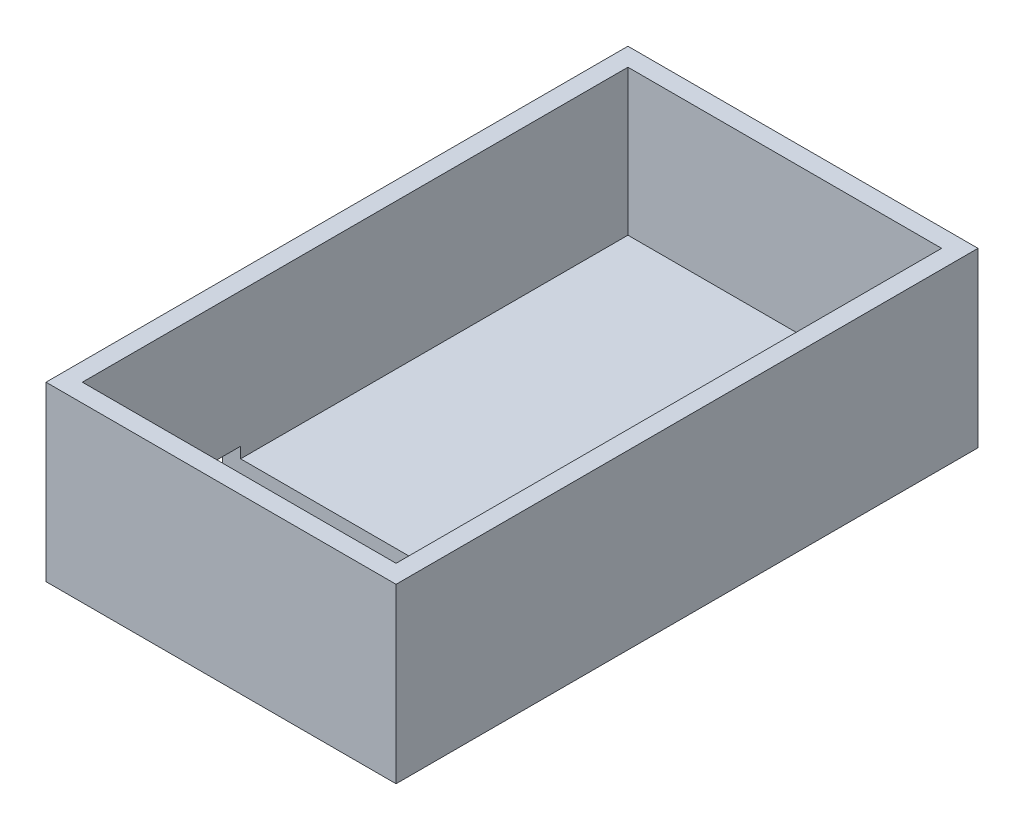
ISO-10303-21;
HEADER;
FILE_DESCRIPTION(('STEP AP214'),'2;1');
FILE_NAME('part.step','',(''),(''),'','','');
FILE_SCHEMA(('AUTOMOTIVE_DESIGN { 1 0 10303 214 1 1 1 1 }'));
ENDSEC;
DATA;
#1=APPLICATION_CONTEXT('core data for automotive mechanical design processes');
#2=APPLICATION_PROTOCOL_DEFINITION('international standard','automotive_design',2000,#1);
#3=PRODUCT_CONTEXT('',#1,'mechanical');
#4=PRODUCT('Part','Part','',(#3));
#5=PRODUCT_RELATED_PRODUCT_CATEGORY('part','',(#4));
#6=PRODUCT_DEFINITION_FORMATION('','',#4);
#7=PRODUCT_DEFINITION_CONTEXT('part definition',#1,'design');
#8=PRODUCT_DEFINITION('design','',#6,#7);
#9=PRODUCT_DEFINITION_SHAPE('','',#8);
#10=(LENGTH_UNIT() NAMED_UNIT(*) SI_UNIT(.MILLI.,.METRE.));
#11=(NAMED_UNIT(*) PLANE_ANGLE_UNIT() SI_UNIT($,.RADIAN.));
#12=(NAMED_UNIT(*) SI_UNIT($,.STERADIAN.) SOLID_ANGLE_UNIT());
#13=UNCERTAINTY_MEASURE_WITH_UNIT(LENGTH_MEASURE(1.E-05),#10,'distance_accuracy_value','');
#14=(GEOMETRIC_REPRESENTATION_CONTEXT(3) GLOBAL_UNCERTAINTY_ASSIGNED_CONTEXT((#13)) GLOBAL_UNIT_ASSIGNED_CONTEXT((#10,
#11,#12)) REPRESENTATION_CONTEXT('',''));
#15=CARTESIAN_POINT('',(0.,0.,0.));
#16=DIRECTION('',(0.,0.,1.));
#17=DIRECTION('',(1.,0.,0.));
#18=AXIS2_PLACEMENT_3D('',#15,#16,#17);
#19=CARTESIAN_POINT('',(0.,1.,0.));
#20=DIRECTION('',(0.,-1.,0.));
#21=DIRECTION('',(0.,0.,-1.));
#22=AXIS2_PLACEMENT_3D('',#19,#20,#21);
#23=PLANE('',#22);
#24=DIRECTION('',(0.,0.,1.));
#25=VECTOR('',#24,1.);
#26=CARTESIAN_POINT('',(20.,1.,-17.4041296579617));
#27=LINE('',#26,#25);
#28=CARTESIAN_POINT('',(20.,1.,-17.4041296579617));
#29=VERTEX_POINT('',#28);
#30=CARTESIAN_POINT('',(20.,1.,-11.4041296579617));
#31=VERTEX_POINT('',#30);
#32=EDGE_CURVE('E179',#29,#31,#27,.T.);
#33=ORIENTED_EDGE('',*,*,#32,.F.);
#34=DIRECTION('',(1.,0.,0.));
#35=VECTOR('',#34,1.);
#36=CARTESIAN_POINT('',(-17.,1.,-17.4041296579617));
#37=LINE('',#36,#35);
#38=CARTESIAN_POINT('',(-2.,1.,-17.4041296579617));
#39=VERTEX_POINT('',#38);
#40=EDGE_CURVE('E202',#39,#29,#37,.T.);
#41=ORIENTED_EDGE('',*,*,#40,.F.);
#42=DIRECTION('',(0.,0.,1.));
#43=VECTOR('',#42,1.);
#44=CARTESIAN_POINT('',(-2.,1.,2.));
#45=LINE('',#44,#43);
#46=CARTESIAN_POINT('',(-2.,1.,-11.4041296579617));
#47=VERTEX_POINT('',#46);
#48=EDGE_CURVE('E240',#39,#47,#45,.T.);
#49=ORIENTED_EDGE('',*,*,#48,.T.);
#50=DIRECTION('',(1.,0.,0.));
#51=VECTOR('',#50,1.);
#52=CARTESIAN_POINT('',(-17.,1.,-11.4041296579617));
#53=LINE('',#52,#51);
#54=EDGE_CURVE('E205',#47,#31,#53,.T.);
#55=ORIENTED_EDGE('',*,*,#54,.T.);
#56=EDGE_LOOP('',(#33,#41,#49,#55));
#57=FACE_BOUND('',#56,.T.);
#58=ADVANCED_FACE('F35',(#57),#23,.F.);
#59=CARTESIAN_POINT('',(34.5,17.,0.));
#60=DIRECTION('',(0.,0.,1.));
#61=DIRECTION('',(1.,0.,0.));
#62=AXIS2_PLACEMENT_3D('',#59,#60,#61);
#63=PLANE('',#62);
#64=DIRECTION('',(0.,-1.,0.));
#65=VECTOR('',#64,1.);
#66=CARTESIAN_POINT('',(34.5,17.,0.));
#67=LINE('',#66,#65);
#68=CARTESIAN_POINT('',(34.5,19.,0.));
#69=VERTEX_POINT('',#68);
#70=CARTESIAN_POINT('',(34.5,3.,0.));
#71=VERTEX_POINT('',#70);
#72=EDGE_CURVE('E212',#69,#71,#67,.T.);
#73=ORIENTED_EDGE('',*,*,#72,.T.);
#74=DIRECTION('',(1.,0.,0.));
#75=VECTOR('',#74,1.);
#76=CARTESIAN_POINT('',(0.,3.,0.));
#77=LINE('',#76,#75);
#78=CARTESIAN_POINT('',(0.,3.,0.));
#79=VERTEX_POINT('',#78);
#80=EDGE_CURVE('E186',#79,#71,#77,.T.);
#81=ORIENTED_EDGE('',*,*,#80,.F.);
#82=DIRECTION('',(0.,-1.,0.));
#83=VECTOR('',#82,1.);
#84=CARTESIAN_POINT('',(0.,17.,0.));
#85=LINE('',#84,#83);
#86=CARTESIAN_POINT('',(0.,19.,0.));
#87=VERTEX_POINT('',#86);
#88=EDGE_CURVE('E204',#87,#79,#85,.T.);
#89=ORIENTED_EDGE('',*,*,#88,.F.);
#90=DIRECTION('',(-1.,0.,0.));
#91=VECTOR('',#90,1.);
#92=CARTESIAN_POINT('',(0.,19.,0.));
#93=LINE('',#92,#91);
#94=EDGE_CURVE('E173',#69,#87,#93,.T.);
#95=ORIENTED_EDGE('',*,*,#94,.F.);
#96=EDGE_LOOP('',(#73,#81,#89,#95));
#97=FACE_BOUND('',#96,.T.);
#98=ADVANCED_FACE('F274',(#97),#63,.F.);
#99=CARTESIAN_POINT('',(34.5,17.,-60.));
#100=DIRECTION('',(1.,0.,0.));
#101=DIRECTION('',(0.,0.,-1.));
#102=AXIS2_PLACEMENT_3D('',#99,#100,#101);
#103=PLANE('',#102);
#104=DIRECTION('',(0.,-1.,0.));
#105=VECTOR('',#104,1.);
#106=CARTESIAN_POINT('',(34.5,17.,-60.));
#107=LINE('',#106,#105);
#108=CARTESIAN_POINT('',(34.5,19.,-60.));
#109=VERTEX_POINT('',#108);
#110=CARTESIAN_POINT('',(34.5,3.,-60.));
#111=VERTEX_POINT('',#110);
#112=EDGE_CURVE('E216',#109,#111,#107,.T.);
#113=ORIENTED_EDGE('',*,*,#112,.T.);
#114=DIRECTION('',(0.,0.,-1.));
#115=VECTOR('',#114,1.);
#116=CARTESIAN_POINT('',(34.5,3.,-60.));
#117=LINE('',#116,#115);
#118=EDGE_CURVE('E188',#71,#111,#117,.T.);
#119=ORIENTED_EDGE('',*,*,#118,.F.);
#120=ORIENTED_EDGE('',*,*,#72,.F.);
#121=DIRECTION('',(0.,0.,1.));
#122=VECTOR('',#121,1.);
#123=CARTESIAN_POINT('',(34.5,19.,0.));
#124=LINE('',#123,#122);
#125=EDGE_CURVE('E170',#109,#69,#124,.T.);
#126=ORIENTED_EDGE('',*,*,#125,.F.);
#127=EDGE_LOOP('',(#113,#119,#120,#126));
#128=FACE_BOUND('',#127,.T.);
#129=ADVANCED_FACE('F278',(#128),#103,.F.);
#130=CARTESIAN_POINT('',(0.,17.,-60.));
#131=DIRECTION('',(0.,0.,-1.));
#132=DIRECTION('',(-1.,0.,0.));
#133=AXIS2_PLACEMENT_3D('',#130,#131,#132);
#134=PLANE('',#133);
#135=DIRECTION('',(0.,-1.,0.));
#136=VECTOR('',#135,1.);
#137=CARTESIAN_POINT('',(0.,17.,-60.));
#138=LINE('',#137,#136);
#139=CARTESIAN_POINT('',(0.,19.,-60.));
#140=VERTEX_POINT('',#139);
#141=CARTESIAN_POINT('',(0.,3.,-60.));
#142=VERTEX_POINT('',#141);
#143=EDGE_CURVE('E219',#140,#142,#138,.T.);
#144=ORIENTED_EDGE('',*,*,#143,.T.);
#145=DIRECTION('',(-1.,0.,0.));
#146=VECTOR('',#145,1.);
#147=CARTESIAN_POINT('',(0.,3.,-60.));
#148=LINE('',#147,#146);
#149=EDGE_CURVE('E190',#111,#142,#148,.T.);
#150=ORIENTED_EDGE('',*,*,#149,.F.);
#151=ORIENTED_EDGE('',*,*,#112,.F.);
#152=DIRECTION('',(1.,0.,0.));
#153=VECTOR('',#152,1.);
#154=CARTESIAN_POINT('',(0.,19.,-60.));
#155=LINE('',#154,#153);
#156=EDGE_CURVE('E167',#140,#109,#155,.T.);
#157=ORIENTED_EDGE('',*,*,#156,.F.);
#158=EDGE_LOOP('',(#144,#150,#151,#157));
#159=FACE_BOUND('',#158,.T.);
#160=ADVANCED_FACE('F281',(#159),#134,.F.);
#161=CARTESIAN_POINT('',(0.,17.,0.));
#162=DIRECTION('',(-1.,0.,0.));
#163=DIRECTION('',(0.,0.,1.));
#164=AXIS2_PLACEMENT_3D('',#161,#162,#163);
#165=PLANE('',#164);
#166=ORIENTED_EDGE('',*,*,#88,.T.);
#167=DIRECTION('',(0.,0.,1.));
#168=VECTOR('',#167,1.);
#169=CARTESIAN_POINT('',(0.,3.,-11.4041296579617));
#170=LINE('',#169,#168);
#171=CARTESIAN_POINT('',(0.,3.,-11.4041296579617));
#172=VERTEX_POINT('',#171);
#173=EDGE_CURVE('E184',#172,#79,#170,.T.);
#174=ORIENTED_EDGE('',*,*,#173,.F.);
#175=DIRECTION('',(0.,-1.,0.));
#176=VECTOR('',#175,1.);
#177=CARTESIAN_POINT('',(0.,1.,-11.4041296579617));
#178=LINE('',#177,#176);
#179=CARTESIAN_POINT('',(0.,4.2,-11.4041296579617));
#180=VERTEX_POINT('',#179);
#181=EDGE_CURVE('E199',#180,#172,#178,.T.);
#182=ORIENTED_EDGE('',*,*,#181,.F.);
#183=DIRECTION('',(0.,0.,1.));
#184=VECTOR('',#183,1.);
#185=CARTESIAN_POINT('',(0.,4.2,-17.4041296579617));
#186=LINE('',#185,#184);
#187=CARTESIAN_POINT('',(0.,4.2,-17.4041296579617));
#188=VERTEX_POINT('',#187);
#189=EDGE_CURVE('E196',#188,#180,#186,.T.);
#190=ORIENTED_EDGE('',*,*,#189,.F.);
#191=DIRECTION('',(0.,1.,0.));
#192=VECTOR('',#191,1.);
#193=CARTESIAN_POINT('',(0.,1.,-17.4041296579617));
#194=LINE('',#193,#192);
#195=CARTESIAN_POINT('',(0.,3.,-17.4041296579617));
#196=VERTEX_POINT('',#195);
#197=EDGE_CURVE('E192',#196,#188,#194,.T.);
#198=ORIENTED_EDGE('',*,*,#197,.F.);
#199=DIRECTION('',(0.,0.,1.));
#200=VECTOR('',#199,1.);
#201=CARTESIAN_POINT('',(0.,3.,-60.));
#202=LINE('',#201,#200);
#203=EDGE_CURVE('E180',#142,#196,#202,.T.);
#204=ORIENTED_EDGE('',*,*,#203,.F.);
#205=ORIENTED_EDGE('',*,*,#143,.F.);
#206=DIRECTION('',(0.,0.,-1.));
#207=VECTOR('',#206,1.);
#208=CARTESIAN_POINT('',(0.,19.,0.));
#209=LINE('',#208,#207);
#210=EDGE_CURVE('E176',#87,#140,#209,.T.);
#211=ORIENTED_EDGE('',*,*,#210,.F.);
#212=EDGE_LOOP('',(#166,#174,#182,#190,#198,#204,#205,#211));
#213=FACE_BOUND('',#212,.T.);
#214=ADVANCED_FACE('F268',(#213),#165,.F.);
#215=CARTESIAN_POINT('',(36.5,17.,2.));
#216=DIRECTION('',(0.,0.,1.));
#217=DIRECTION('',(1.,0.,0.));
#218=AXIS2_PLACEMENT_3D('',#215,#216,#217);
#219=PLANE('',#218);
#220=DIRECTION('',(-1.,0.,0.));
#221=VECTOR('',#220,1.);
#222=CARTESIAN_POINT('',(36.5,0.,2.));
#223=LINE('',#222,#221);
#224=CARTESIAN_POINT('',(36.5,0.,2.));
#225=VERTEX_POINT('',#224);
#226=CARTESIAN_POINT('',(-2.,0.,2.));
#227=VERTEX_POINT('',#226);
#228=EDGE_CURVE('E215',#225,#227,#223,.T.);
#229=ORIENTED_EDGE('',*,*,#228,.F.);
#230=DIRECTION('',(0.,-1.,0.));
#231=VECTOR('',#230,1.);
#232=CARTESIAN_POINT('',(36.5,17.,2.));
#233=LINE('',#232,#231);
#234=CARTESIAN_POINT('',(36.5,19.,2.));
#235=VERTEX_POINT('',#234);
#236=EDGE_CURVE('E152',#235,#225,#233,.T.);
#237=ORIENTED_EDGE('',*,*,#236,.F.);
#238=DIRECTION('',(1.,0.,0.));
#239=VECTOR('',#238,1.);
#240=CARTESIAN_POINT('',(0.,19.,2.));
#241=LINE('',#240,#239);
#242=CARTESIAN_POINT('',(-2.,19.,2.));
#243=VERTEX_POINT('',#242);
#244=EDGE_CURVE('E150',#243,#235,#241,.T.);
#245=ORIENTED_EDGE('',*,*,#244,.F.);
#246=DIRECTION('',(0.,-1.,0.));
#247=VECTOR('',#246,1.);
#248=CARTESIAN_POINT('',(-2.,17.,2.));
#249=LINE('',#248,#247);
#250=EDGE_CURVE('E136',#243,#227,#249,.T.);
#251=ORIENTED_EDGE('',*,*,#250,.T.);
#252=EDGE_LOOP('',(#229,#237,#245,#251));
#253=FACE_BOUND('',#252,.T.);
#254=ADVANCED_FACE('F151',(#253),#219,.T.);
#255=CARTESIAN_POINT('',(36.5,17.,-62.));
#256=DIRECTION('',(1.,0.,0.));
#257=DIRECTION('',(0.,0.,-1.));
#258=AXIS2_PLACEMENT_3D('',#255,#256,#257);
#259=PLANE('',#258);
#260=DIRECTION('',(0.,0.,1.));
#261=VECTOR('',#260,1.);
#262=CARTESIAN_POINT('',(36.5,0.,-62.));
#263=LINE('',#262,#261);
#264=CARTESIAN_POINT('',(36.5,0.,-62.));
#265=VERTEX_POINT('',#264);
#266=EDGE_CURVE('E147',#265,#225,#263,.T.);
#267=ORIENTED_EDGE('',*,*,#266,.F.);
#268=DIRECTION('',(0.,-1.,0.));
#269=VECTOR('',#268,1.);
#270=CARTESIAN_POINT('',(36.5,17.,-62.));
#271=LINE('',#270,#269);
#272=CARTESIAN_POINT('',(36.5,19.,-62.));
#273=VERTEX_POINT('',#272);
#274=EDGE_CURVE('E233',#273,#265,#271,.T.);
#275=ORIENTED_EDGE('',*,*,#274,.F.);
#276=DIRECTION('',(0.,0.,-1.));
#277=VECTOR('',#276,1.);
#278=CARTESIAN_POINT('',(36.5,19.,0.));
#279=LINE('',#278,#277);
#280=EDGE_CURVE('E156',#235,#273,#279,.T.);
#281=ORIENTED_EDGE('',*,*,#280,.F.);
#282=ORIENTED_EDGE('',*,*,#236,.T.);
#283=EDGE_LOOP('',(#267,#275,#281,#282));
#284=FACE_BOUND('',#283,.T.);
#285=ADVANCED_FACE('F314',(#284),#259,.T.);
#286=CARTESIAN_POINT('',(-2.00000000000001,17.,-62.));
#287=DIRECTION('',(0.,0.,-1.));
#288=DIRECTION('',(-1.,0.,0.));
#289=AXIS2_PLACEMENT_3D('',#286,#287,#288);
#290=PLANE('',#289);
#291=DIRECTION('',(1.,0.,0.));
#292=VECTOR('',#291,1.);
#293=CARTESIAN_POINT('',(-2.00000000000001,0.,-62.));
#294=LINE('',#293,#292);
#295=CARTESIAN_POINT('',(-2.00000000000001,0.,-62.));
#296=VERTEX_POINT('',#295);
#297=EDGE_CURVE('E226',#296,#265,#294,.T.);
#298=ORIENTED_EDGE('',*,*,#297,.F.);
#299=DIRECTION('',(0.,-1.,0.));
#300=VECTOR('',#299,1.);
#301=CARTESIAN_POINT('',(-2.00000000000001,17.,-62.));
#302=LINE('',#301,#300);
#303=CARTESIAN_POINT('',(-2.00000000000001,19.,-62.));
#304=VERTEX_POINT('',#303);
#305=EDGE_CURVE('E146',#304,#296,#302,.T.);
#306=ORIENTED_EDGE('',*,*,#305,.F.);
#307=DIRECTION('',(-1.,0.,0.));
#308=VECTOR('',#307,1.);
#309=CARTESIAN_POINT('',(0.,19.,-62.));
#310=LINE('',#309,#308);
#311=EDGE_CURVE('E162',#273,#304,#310,.T.);
#312=ORIENTED_EDGE('',*,*,#311,.F.);
#313=ORIENTED_EDGE('',*,*,#274,.T.);
#314=EDGE_LOOP('',(#298,#306,#312,#313));
#315=FACE_BOUND('',#314,.T.);
#316=ADVANCED_FACE('F310',(#315),#290,.T.);
#317=CARTESIAN_POINT('',(-2.,17.,2.));
#318=DIRECTION('',(-1.,0.,0.));
#319=DIRECTION('',(0.,0.,1.));
#320=AXIS2_PLACEMENT_3D('',#317,#318,#319);
#321=PLANE('',#320);
#322=DIRECTION('',(0.,-1.,0.));
#323=VECTOR('',#322,1.);
#324=CARTESIAN_POINT('',(-2.,17.,-17.4041296579617));
#325=LINE('',#324,#323);
#326=CARTESIAN_POINT('',(-2.,4.2,-17.4041296579617));
#327=VERTEX_POINT('',#326);
#328=EDGE_CURVE('E242',#327,#39,#325,.T.);
#329=ORIENTED_EDGE('',*,*,#328,.F.);
#330=DIRECTION('',(0.,0.,-1.));
#331=VECTOR('',#330,1.);
#332=CARTESIAN_POINT('',(-2.,4.2,2.));
#333=LINE('',#332,#331);
#334=CARTESIAN_POINT('',(-2.,4.2,-11.4041296579617));
#335=VERTEX_POINT('',#334);
#336=EDGE_CURVE('E232',#335,#327,#333,.T.);
#337=ORIENTED_EDGE('',*,*,#336,.F.);
#338=DIRECTION('',(0.,1.,0.));
#339=VECTOR('',#338,1.);
#340=CARTESIAN_POINT('',(-2.,17.,-11.4041296579617));
#341=LINE('',#340,#339);
#342=EDGE_CURVE('E237',#47,#335,#341,.T.);
#343=ORIENTED_EDGE('',*,*,#342,.F.);
#344=ORIENTED_EDGE('',*,*,#48,.F.);
#345=EDGE_LOOP('',(#329,#337,#343,#344));
#346=FACE_BOUND('',#345,.T.);
#347=DIRECTION('',(0.,0.,-1.));
#348=VECTOR('',#347,1.);
#349=CARTESIAN_POINT('',(-2.,0.,2.));
#350=LINE('',#349,#348);
#351=EDGE_CURVE('E142',#227,#296,#350,.T.);
#352=ORIENTED_EDGE('',*,*,#351,.F.);
#353=ORIENTED_EDGE('',*,*,#250,.F.);
#354=DIRECTION('',(0.,0.,1.));
#355=VECTOR('',#354,1.);
#356=CARTESIAN_POINT('',(-2.,19.,0.));
#357=LINE('',#356,#355);
#358=EDGE_CURVE('E140',#304,#243,#357,.T.);
#359=ORIENTED_EDGE('',*,*,#358,.F.);
#360=ORIENTED_EDGE('',*,*,#305,.T.);
#361=EDGE_LOOP('',(#352,#353,#359,#360));
#362=FACE_BOUND('',#361,.T.);
#363=ADVANCED_FACE('F138',(#346,#362),#321,.T.);
#364=CARTESIAN_POINT('',(0.,0.,0.));
#365=DIRECTION('',(0.,-1.,0.));
#366=DIRECTION('',(0.,0.,-1.));
#367=AXIS2_PLACEMENT_3D('',#364,#365,#366);
#368=PLANE('',#367);
#369=ORIENTED_EDGE('',*,*,#228,.T.);
#370=ORIENTED_EDGE('',*,*,#351,.T.);
#371=ORIENTED_EDGE('',*,*,#297,.T.);
#372=ORIENTED_EDGE('',*,*,#266,.T.);
#373=EDGE_LOOP('',(#369,#370,#371,#372));
#374=FACE_BOUND('',#373,.T.);
#375=ADVANCED_FACE('F302',(#374),#368,.T.);
#376=CARTESIAN_POINT('',(-17.,1.,-17.4041296579617));
#377=DIRECTION('',(0.,0.,-1.));
#378=DIRECTION('',(-1.,0.,0.));
#379=AXIS2_PLACEMENT_3D('',#376,#377,#378);
#380=PLANE('',#379);
#381=ORIENTED_EDGE('',*,*,#328,.T.);
#382=ORIENTED_EDGE('',*,*,#40,.T.);
#383=DIRECTION('',(0.707106781186546,0.707106781186549,0.));
#384=VECTOR('',#383,1.);
#385=CARTESIAN_POINT('',(1.50000000000006,-17.5,-17.4041296579617));
#386=LINE('',#385,#384);
#387=CARTESIAN_POINT('',(22.,3.,-17.4041296579617));
#388=VERTEX_POINT('',#387);
#389=EDGE_CURVE('E11',#29,#388,#386,.T.);
#390=ORIENTED_EDGE('',*,*,#389,.T.);
#391=DIRECTION('',(1.,0.,0.));
#392=VECTOR('',#391,1.);
#393=CARTESIAN_POINT('',(0.,3.,-17.4041296579617));
#394=LINE('',#393,#392);
#395=EDGE_CURVE('E58',#196,#388,#394,.T.);
#396=ORIENTED_EDGE('',*,*,#395,.F.);
#397=ORIENTED_EDGE('',*,*,#197,.T.);
#398=DIRECTION('',(1.,0.,0.));
#399=VECTOR('',#398,1.);
#400=CARTESIAN_POINT('',(-17.,4.2,-17.4041296579617));
#401=LINE('',#400,#399);
#402=EDGE_CURVE('E201',#327,#188,#401,.T.);
#403=ORIENTED_EDGE('',*,*,#402,.F.);
#404=EDGE_LOOP('',(#381,#382,#390,#396,#397,#403));
#405=FACE_BOUND('',#404,.T.);
#406=ADVANCED_FACE('F256',(#405),#380,.F.);
#407=CARTESIAN_POINT('',(-17.,1.,-11.4041296579617));
#408=DIRECTION('',(0.,0.,1.));
#409=DIRECTION('',(1.,0.,0.));
#410=AXIS2_PLACEMENT_3D('',#407,#408,#409);
#411=PLANE('',#410);
#412=ORIENTED_EDGE('',*,*,#342,.T.);
#413=DIRECTION('',(1.,0.,0.));
#414=VECTOR('',#413,1.);
#415=CARTESIAN_POINT('',(-17.,4.2,-11.4041296579617));
#416=LINE('',#415,#414);
#417=EDGE_CURVE('E208',#335,#180,#416,.T.);
#418=ORIENTED_EDGE('',*,*,#417,.T.);
#419=ORIENTED_EDGE('',*,*,#181,.T.);
#420=DIRECTION('',(-1.,0.,0.));
#421=VECTOR('',#420,1.);
#422=CARTESIAN_POINT('',(0.,3.,-11.4041296579617));
#423=LINE('',#422,#421);
#424=CARTESIAN_POINT('',(22.,3.,-11.4041296579617));
#425=VERTEX_POINT('',#424);
#426=EDGE_CURVE('E50',#425,#172,#423,.T.);
#427=ORIENTED_EDGE('',*,*,#426,.F.);
#428=DIRECTION('',(-0.707106781186546,-0.707106781186549,0.));
#429=VECTOR('',#428,1.);
#430=CARTESIAN_POINT('',(1.50000000000006,-17.5,-11.4041296579617));
#431=LINE('',#430,#429);
#432=EDGE_CURVE('E43',#425,#31,#431,.T.);
#433=ORIENTED_EDGE('',*,*,#432,.T.);
#434=ORIENTED_EDGE('',*,*,#54,.F.);
#435=EDGE_LOOP('',(#412,#418,#419,#427,#433,#434));
#436=FACE_BOUND('',#435,.T.);
#437=ADVANCED_FACE('F246',(#436),#411,.F.);
#438=CARTESIAN_POINT('',(-17.,4.2,-17.4041296579617));
#439=DIRECTION('',(0.,1.,0.));
#440=DIRECTION('',(0.,0.,1.));
#441=AXIS2_PLACEMENT_3D('',#438,#439,#440);
#442=PLANE('',#441);
#443=ORIENTED_EDGE('',*,*,#336,.T.);
#444=ORIENTED_EDGE('',*,*,#402,.T.);
#445=ORIENTED_EDGE('',*,*,#189,.T.);
#446=ORIENTED_EDGE('',*,*,#417,.F.);
#447=EDGE_LOOP('',(#443,#444,#445,#446));
#448=FACE_BOUND('',#447,.T.);
#449=ADVANCED_FACE('F264',(#448),#442,.F.);
#450=CARTESIAN_POINT('',(0.,3.,0.));
#451=DIRECTION('',(0.,1.,0.));
#452=DIRECTION('',(0.,0.,1.));
#453=AXIS2_PLACEMENT_3D('',#450,#451,#452);
#454=PLANE('',#453);
#455=DIRECTION('',(0.,0.,1.));
#456=VECTOR('',#455,1.);
#457=CARTESIAN_POINT('',(22.,3.,-11.4041296579617));
#458=LINE('',#457,#456);
#459=EDGE_CURVE('E244',#388,#425,#458,.T.);
#460=ORIENTED_EDGE('',*,*,#459,.T.);
#461=ORIENTED_EDGE('',*,*,#426,.T.);
#462=ORIENTED_EDGE('',*,*,#173,.T.);
#463=ORIENTED_EDGE('',*,*,#80,.T.);
#464=ORIENTED_EDGE('',*,*,#118,.T.);
#465=ORIENTED_EDGE('',*,*,#149,.T.);
#466=ORIENTED_EDGE('',*,*,#203,.T.);
#467=ORIENTED_EDGE('',*,*,#395,.T.);
#468=EDGE_LOOP('',(#460,#461,#462,#463,#464,#465,#466,#467));
#469=FACE_BOUND('',#468,.T.);
#470=ADVANCED_FACE('F271',(#469),#454,.T.);
#471=CARTESIAN_POINT('',(0.,19.,0.));
#472=DIRECTION('',(0.,1.,0.));
#473=DIRECTION('',(0.,0.,1.));
#474=AXIS2_PLACEMENT_3D('',#471,#472,#473);
#475=PLANE('',#474);
#476=ORIENTED_EDGE('',*,*,#358,.T.);
#477=ORIENTED_EDGE('',*,*,#244,.T.);
#478=ORIENTED_EDGE('',*,*,#280,.T.);
#479=ORIENTED_EDGE('',*,*,#311,.T.);
#480=EDGE_LOOP('',(#476,#477,#478,#479));
#481=FACE_BOUND('',#480,.T.);
#482=ORIENTED_EDGE('',*,*,#156,.T.);
#483=ORIENTED_EDGE('',*,*,#125,.T.);
#484=ORIENTED_EDGE('',*,*,#94,.T.);
#485=ORIENTED_EDGE('',*,*,#210,.T.);
#486=EDGE_LOOP('',(#482,#483,#484,#485));
#487=FACE_BOUND('',#486,.T.);
#488=ADVANCED_FACE('F159',(#481,#487),#475,.T.);
#489=CARTESIAN_POINT('',(22.,3.,0.));
#490=DIRECTION('',(-0.707106781186549,0.707106781186546,0.));
#491=DIRECTION('',(0.,0.,-1.));
#492=AXIS2_PLACEMENT_3D('',#489,#490,#491);
#493=PLANE('',#492);
#494=ORIENTED_EDGE('',*,*,#389,.F.);
#495=ORIENTED_EDGE('',*,*,#32,.T.);
#496=ORIENTED_EDGE('',*,*,#432,.F.);
#497=ORIENTED_EDGE('',*,*,#459,.F.);
#498=EDGE_LOOP('',(#494,#495,#496,#497));
#499=FACE_BOUND('',#498,.T.);
#500=ADVANCED_FACE('F37',(#499),#493,.T.);
#501=CLOSED_SHELL('',(#58,#98,#129,#160,#214,#254,#285,#316,#363,#375,#406,#437,#449,#470,#488,#500));
#502=MANIFOLD_SOLID_BREP('B2',#501);
#503=ADVANCED_BREP_SHAPE_REPRESENTATION('',(#18,#502),#14);
#504=SHAPE_DEFINITION_REPRESENTATION(#9,#503);
ENDSEC;
END-ISO-10303-21;
